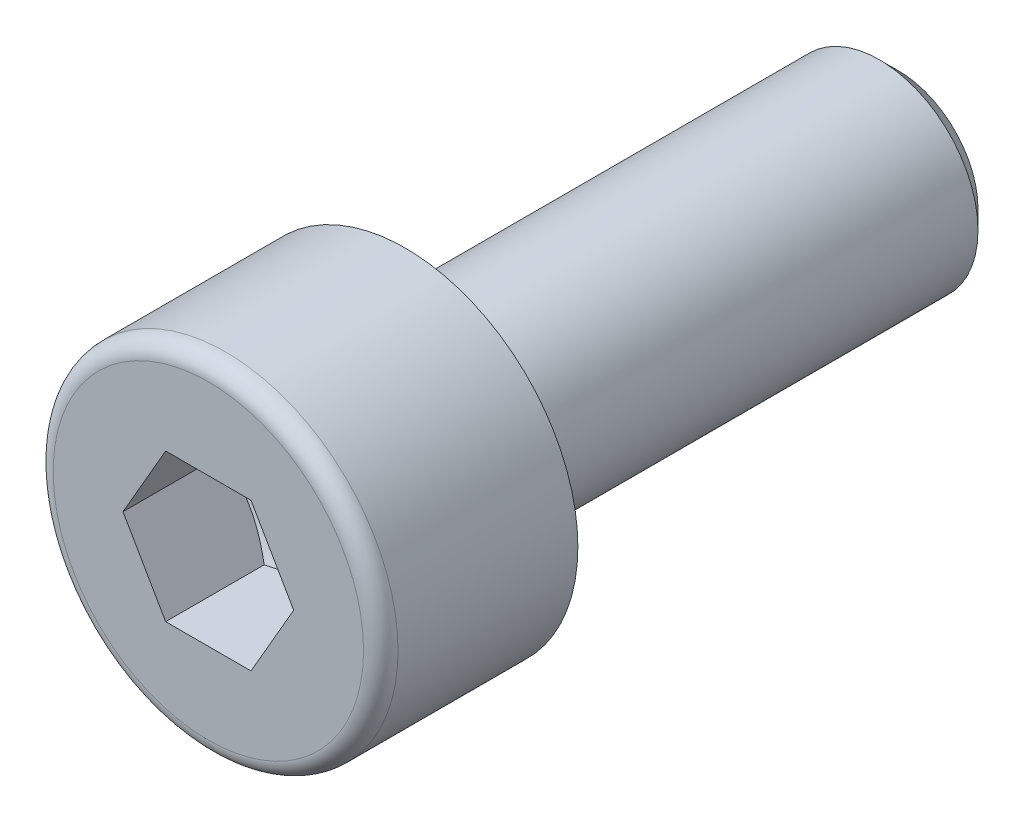
ISO-10303-21;
HEADER;
FILE_DESCRIPTION(('STEP AP214'),'2;1');
FILE_NAME('part.step','',(''),(''),'','','');
FILE_SCHEMA(('AUTOMOTIVE_DESIGN { 1 0 10303 214 1 1 1 1 }'));
ENDSEC;
DATA;
#1=APPLICATION_CONTEXT('core data for automotive mechanical design processes');
#2=APPLICATION_PROTOCOL_DEFINITION('international standard','automotive_design',2000,#1);
#3=PRODUCT_CONTEXT('',#1,'mechanical');
#4=PRODUCT('Part','Part','',(#3));
#5=PRODUCT_RELATED_PRODUCT_CATEGORY('part','',(#4));
#6=PRODUCT_DEFINITION_FORMATION('','',#4);
#7=PRODUCT_DEFINITION_CONTEXT('part definition',#1,'design');
#8=PRODUCT_DEFINITION('design','',#6,#7);
#9=PRODUCT_DEFINITION_SHAPE('','',#8);
#10=(LENGTH_UNIT() NAMED_UNIT(*) SI_UNIT(.MILLI.,.METRE.));
#11=(NAMED_UNIT(*) PLANE_ANGLE_UNIT() SI_UNIT($,.RADIAN.));
#12=(NAMED_UNIT(*) SI_UNIT($,.STERADIAN.) SOLID_ANGLE_UNIT());
#13=UNCERTAINTY_MEASURE_WITH_UNIT(LENGTH_MEASURE(1.E-05),#10,'distance_accuracy_value','');
#14=(GEOMETRIC_REPRESENTATION_CONTEXT(3) GLOBAL_UNCERTAINTY_ASSIGNED_CONTEXT((#13)) GLOBAL_UNIT_ASSIGNED_CONTEXT((#10,
#11,#12)) REPRESENTATION_CONTEXT('',''));
#15=CARTESIAN_POINT('',(0.,0.,0.));
#16=DIRECTION('',(0.,0.,1.));
#17=DIRECTION('',(1.,0.,0.));
#18=AXIS2_PLACEMENT_3D('',#15,#16,#17);
#19=CARTESIAN_POINT('',(0.,0.,4.));
#20=DIRECTION('',(0.,0.,1.));
#21=DIRECTION('',(1.,0.,0.));
#22=AXIS2_PLACEMENT_3D('',#19,#20,#21);
#23=PLANE('',#22);
#24=CARTESIAN_POINT('',(0.,0.,4.));
#25=DIRECTION('',(0.,0.,1.));
#26=DIRECTION('',(1.,0.,0.));
#27=AXIS2_PLACEMENT_3D('',#24,#25,#26);
#28=CIRCLE('',#27,3.15);
#29=CARTESIAN_POINT('',(3.15,0.,4.));
#30=VERTEX_POINT('',#29);
#31=EDGE_CURVE('E11',#30,#30,#28,.T.);
#32=ORIENTED_EDGE('',*,*,#31,.T.);
#33=EDGE_LOOP('',(#32));
#34=FACE_BOUND('',#33,.T.);
#35=DIRECTION('',(1.,0.,0.));
#36=VECTOR('',#35,1.);
#37=CARTESIAN_POINT('',(-0.866025,1.49999930062484,4.));
#38=LINE('',#37,#36);
#39=CARTESIAN_POINT('',(-0.866025,1.49999930062484,4.));
#40=VERTEX_POINT('',#39);
#41=CARTESIAN_POINT('',(0.866025,1.49999930062484,4.));
#42=VERTEX_POINT('',#41);
#43=EDGE_CURVE('E92',#40,#42,#38,.T.);
#44=ORIENTED_EDGE('',*,*,#43,.T.);
#45=DIRECTION('',(0.5,-0.866025403784439,0.));
#46=VECTOR('',#45,1.);
#47=CARTESIAN_POINT('',(0.866025,1.49999930062484,4.));
#48=LINE('',#47,#46);
#49=CARTESIAN_POINT('',(1.73205,0.,4.));
#50=VERTEX_POINT('',#49);
#51=EDGE_CURVE('E31',#42,#50,#48,.T.);
#52=ORIENTED_EDGE('',*,*,#51,.T.);
#53=DIRECTION('',(-0.5,-0.866025403784439,0.));
#54=VECTOR('',#53,1.);
#55=CARTESIAN_POINT('',(1.73205,0.,4.));
#56=LINE('',#55,#54);
#57=CARTESIAN_POINT('',(0.866025,-1.49999930062484,4.));
#58=VERTEX_POINT('',#57);
#59=EDGE_CURVE('E169',#50,#58,#56,.T.);
#60=ORIENTED_EDGE('',*,*,#59,.T.);
#61=DIRECTION('',(-1.,0.,0.));
#62=VECTOR('',#61,1.);
#63=CARTESIAN_POINT('',(0.866025,-1.49999930062484,4.));
#64=LINE('',#63,#62);
#65=CARTESIAN_POINT('',(-0.866025,-1.49999930062484,4.));
#66=VERTEX_POINT('',#65);
#67=EDGE_CURVE('E165',#58,#66,#64,.T.);
#68=ORIENTED_EDGE('',*,*,#67,.T.);
#69=DIRECTION('',(-0.5,0.866025403784439,0.));
#70=VECTOR('',#69,1.);
#71=CARTESIAN_POINT('',(-0.866025,-1.49999930062484,4.));
#72=LINE('',#71,#70);
#73=CARTESIAN_POINT('',(-1.73205,0.,4.));
#74=VERTEX_POINT('',#73);
#75=EDGE_CURVE('E160',#66,#74,#72,.T.);
#76=ORIENTED_EDGE('',*,*,#75,.T.);
#77=DIRECTION('',(0.5,0.866025403784439,0.));
#78=VECTOR('',#77,1.);
#79=CARTESIAN_POINT('',(-1.73205,0.,4.));
#80=LINE('',#79,#78);
#81=EDGE_CURVE('E96',#74,#40,#80,.T.);
#82=ORIENTED_EDGE('',*,*,#81,.T.);
#83=EDGE_LOOP('',(#44,#52,#60,#68,#76,#82));
#84=FACE_BOUND('',#83,.T.);
#85=ADVANCED_FACE('F17',(#34,#84),#23,.T.);
#86=CARTESIAN_POINT('',(0.,0.,3.65));
#87=DIRECTION('',(0.,0.,1.));
#88=DIRECTION('',(1.,0.,0.));
#89=AXIS2_PLACEMENT_3D('',#86,#87,#88);
#90=TOROIDAL_SURFACE('',#89,3.15,0.35);
#91=ORIENTED_EDGE('',*,*,#31,.F.);
#92=EDGE_LOOP('',(#91));
#93=FACE_BOUND('',#92,.T.);
#94=CARTESIAN_POINT('',(0.,0.,3.65));
#95=DIRECTION('',(0.,0.,1.));
#96=DIRECTION('',(1.,0.,0.));
#97=AXIS2_PLACEMENT_3D('',#94,#95,#96);
#98=CIRCLE('',#97,3.5);
#99=CARTESIAN_POINT('',(3.5,0.,3.65));
#100=VERTEX_POINT('',#99);
#101=EDGE_CURVE('E24',#100,#100,#98,.T.);
#102=ORIENTED_EDGE('',*,*,#101,.T.);
#103=EDGE_LOOP('',(#102));
#104=FACE_BOUND('',#103,.T.);
#105=ADVANCED_FACE('F133',(#93,#104),#90,.T.);
#106=CARTESIAN_POINT('',(0.,0.,4.));
#107=DIRECTION('',(0.,0.,1.));
#108=DIRECTION('',(1.,0.,0.));
#109=AXIS2_PLACEMENT_3D('',#106,#107,#108);
#110=CYLINDRICAL_SURFACE('',#109,3.5);
#111=CARTESIAN_POINT('',(0.,0.,0.));
#112=DIRECTION('',(0.,0.,1.));
#113=DIRECTION('',(1.,0.,0.));
#114=AXIS2_PLACEMENT_3D('',#111,#112,#113);
#115=CIRCLE('',#114,3.5);
#116=CARTESIAN_POINT('',(3.5,0.,0.));
#117=VERTEX_POINT('',#116);
#118=EDGE_CURVE('E128',#117,#117,#115,.T.);
#119=ORIENTED_EDGE('',*,*,#118,.T.);
#120=EDGE_LOOP('',(#119));
#121=FACE_BOUND('',#120,.T.);
#122=ORIENTED_EDGE('',*,*,#101,.F.);
#123=EDGE_LOOP('',(#122));
#124=FACE_BOUND('',#123,.T.);
#125=ADVANCED_FACE('F135',(#121,#124),#110,.T.);
#126=CARTESIAN_POINT('',(0.,3.5,0.));
#127=DIRECTION('',(0.,0.,-1.));
#128=DIRECTION('',(-1.,0.,0.));
#129=AXIS2_PLACEMENT_3D('',#126,#127,#128);
#130=PLANE('',#129);
#131=CARTESIAN_POINT('',(0.,0.,0.));
#132=DIRECTION('',(0.,0.,1.));
#133=DIRECTION('',(1.,0.,0.));
#134=AXIS2_PLACEMENT_3D('',#131,#132,#133);
#135=CIRCLE('',#134,2.2);
#136=CARTESIAN_POINT('',(2.2,0.,0.));
#137=VERTEX_POINT('',#136);
#138=EDGE_CURVE('E125',#137,#137,#135,.T.);
#139=ORIENTED_EDGE('',*,*,#138,.T.);
#140=EDGE_LOOP('',(#139));
#141=FACE_BOUND('',#140,.T.);
#142=ORIENTED_EDGE('',*,*,#118,.F.);
#143=EDGE_LOOP('',(#142));
#144=FACE_BOUND('',#143,.T.);
#145=ADVANCED_FACE('F137',(#141,#144),#130,.T.);
#146=CARTESIAN_POINT('',(0.,0.,-0.2));
#147=DIRECTION('',(0.,0.,1.));
#148=DIRECTION('',(1.,0.,0.));
#149=AXIS2_PLACEMENT_3D('',#146,#147,#148);
#150=TOROIDAL_SURFACE('',#149,2.2,0.2);
#151=CARTESIAN_POINT('',(0.,0.,-0.2));
#152=DIRECTION('',(0.,0.,1.));
#153=DIRECTION('',(1.,0.,0.));
#154=AXIS2_PLACEMENT_3D('',#151,#152,#153);
#155=CIRCLE('',#154,2.);
#156=CARTESIAN_POINT('',(2.,0.,-0.2));
#157=VERTEX_POINT('',#156);
#158=EDGE_CURVE('E122',#157,#157,#155,.T.);
#159=ORIENTED_EDGE('',*,*,#158,.T.);
#160=EDGE_LOOP('',(#159));
#161=FACE_BOUND('',#160,.T.);
#162=ORIENTED_EDGE('',*,*,#138,.F.);
#163=EDGE_LOOP('',(#162));
#164=FACE_BOUND('',#163,.T.);
#165=ADVANCED_FACE('F145',(#161,#164),#150,.F.);
#166=CARTESIAN_POINT('',(0.,0.,4.));
#167=DIRECTION('',(0.,0.,1.));
#168=DIRECTION('',(1.,0.,0.));
#169=AXIS2_PLACEMENT_3D('',#166,#167,#168);
#170=CYLINDRICAL_SURFACE('',#169,2.);
#171=CARTESIAN_POINT('',(0.,0.,-0.201));
#172=DIRECTION('',(0.,0.,1.));
#173=DIRECTION('',(1.,0.,0.));
#174=AXIS2_PLACEMENT_3D('',#171,#172,#173);
#175=CIRCLE('',#174,2.);
#176=CARTESIAN_POINT('',(2.,0.,-0.201));
#177=VERTEX_POINT('',#176);
#178=EDGE_CURVE('E119',#177,#177,#175,.T.);
#179=ORIENTED_EDGE('',*,*,#178,.T.);
#180=EDGE_LOOP('',(#179));
#181=FACE_BOUND('',#180,.T.);
#182=ORIENTED_EDGE('',*,*,#158,.F.);
#183=EDGE_LOOP('',(#182));
#184=FACE_BOUND('',#183,.T.);
#185=ADVANCED_FACE('F346',(#181,#184),#170,.T.);
#186=CARTESIAN_POINT('',(0.,0.,-0.201));
#187=DIRECTION('',(0.,0.,1.));
#188=DIRECTION('',(1.,0.,0.));
#189=AXIS2_PLACEMENT_3D('',#186,#187,#188);
#190=CONICAL_SURFACE('',#189,2.,0.523598775598299);
#191=CARTESIAN_POINT('',(0.,0.,-0.857230749717659));
#192=DIRECTION('',(0.,0.,1.));
#193=DIRECTION('',(1.,0.,0.));
#194=AXIS2_PLACEMENT_3D('',#191,#192,#193);
#195=CIRCLE('',#194,1.621125);
#196=CARTESIAN_POINT('',(1.621125,0.,-0.857230749717659));
#197=VERTEX_POINT('',#196);
#198=EDGE_CURVE('E116',#197,#197,#195,.T.);
#199=ORIENTED_EDGE('',*,*,#198,.T.);
#200=EDGE_LOOP('',(#199));
#201=FACE_BOUND('',#200,.T.);
#202=ORIENTED_EDGE('',*,*,#178,.F.);
#203=EDGE_LOOP('',(#202));
#204=FACE_BOUND('',#203,.T.);
#205=ADVANCED_FACE('F337',(#201,#204),#190,.T.);
#206=CARTESIAN_POINT('',(0.,1.621125,-0.857230749717659));
#207=DIRECTION('',(0.,0.,1.));
#208=DIRECTION('',(1.,0.,0.));
#209=AXIS2_PLACEMENT_3D('',#206,#207,#208);
#210=PLANE('',#209);
#211=CARTESIAN_POINT('',(0.,0.,-0.857230749717659));
#212=DIRECTION('',(0.,0.,1.));
#213=DIRECTION('',(1.,0.,0.));
#214=AXIS2_PLACEMENT_3D('',#211,#212,#213);
#215=CIRCLE('',#214,2.);
#216=CARTESIAN_POINT('',(2.,0.,-0.857230749717659));
#217=VERTEX_POINT('',#216);
#218=EDGE_CURVE('E113',#217,#217,#215,.T.);
#219=ORIENTED_EDGE('',*,*,#218,.T.);
#220=EDGE_LOOP('',(#219));
#221=FACE_BOUND('',#220,.T.);
#222=ORIENTED_EDGE('',*,*,#198,.F.);
#223=EDGE_LOOP('',(#222));
#224=FACE_BOUND('',#223,.T.);
#225=ADVANCED_FACE('F322',(#221,#224),#210,.T.);
#226=CARTESIAN_POINT('',(0.,0.,4.));
#227=DIRECTION('',(0.,0.,1.));
#228=DIRECTION('',(1.,0.,0.));
#229=AXIS2_PLACEMENT_3D('',#226,#227,#228);
#230=CYLINDRICAL_SURFACE('',#229,2.);
#231=CARTESIAN_POINT('',(0.,0.,-9.621125));
#232=DIRECTION('',(0.,0.,1.));
#233=DIRECTION('',(1.,0.,0.));
#234=AXIS2_PLACEMENT_3D('',#231,#232,#233);
#235=CIRCLE('',#234,2.);
#236=CARTESIAN_POINT('',(2.,0.,-9.621125));
#237=VERTEX_POINT('',#236);
#238=EDGE_CURVE('E110',#237,#237,#235,.T.);
#239=ORIENTED_EDGE('',*,*,#238,.T.);
#240=EDGE_LOOP('',(#239));
#241=FACE_BOUND('',#240,.T.);
#242=ORIENTED_EDGE('',*,*,#218,.F.);
#243=EDGE_LOOP('',(#242));
#244=FACE_BOUND('',#243,.T.);
#245=ADVANCED_FACE('F311',(#241,#244),#230,.T.);
#246=CARTESIAN_POINT('',(0.,0.,-9.621125));
#247=DIRECTION('',(0.,0.,1.));
#248=DIRECTION('',(1.,0.,0.));
#249=AXIS2_PLACEMENT_3D('',#246,#247,#248);
#250=CONICAL_SURFACE('',#249,2.,0.785398163397448);
#251=CARTESIAN_POINT('',(0.,0.,-10.));
#252=DIRECTION('',(0.,0.,1.));
#253=DIRECTION('',(1.,0.,0.));
#254=AXIS2_PLACEMENT_3D('',#251,#252,#253);
#255=CIRCLE('',#254,1.621125);
#256=CARTESIAN_POINT('',(1.621125,0.,-10.));
#257=VERTEX_POINT('',#256);
#258=EDGE_CURVE('E107',#257,#257,#255,.T.);
#259=ORIENTED_EDGE('',*,*,#258,.T.);
#260=EDGE_LOOP('',(#259));
#261=FACE_BOUND('',#260,.T.);
#262=ORIENTED_EDGE('',*,*,#238,.F.);
#263=EDGE_LOOP('',(#262));
#264=FACE_BOUND('',#263,.T.);
#265=ADVANCED_FACE('F303',(#261,#264),#250,.T.);
#266=CARTESIAN_POINT('',(0.,1.621125,-10.));
#267=DIRECTION('',(0.,0.,-1.));
#268=DIRECTION('',(-1.,0.,0.));
#269=AXIS2_PLACEMENT_3D('',#266,#267,#268);
#270=PLANE('',#269);
#271=ORIENTED_EDGE('',*,*,#258,.F.);
#272=EDGE_LOOP('',(#271));
#273=FACE_BOUND('',#272,.T.);
#274=ADVANCED_FACE('F225',(#273),#270,.T.);
#275=CARTESIAN_POINT('',(0.866025,1.49999930062484,1.00000046625011));
#276=DIRECTION('',(-0.866025403784439,-0.5,0.));
#277=DIRECTION('',(-0.5,0.866025403784439,0.));
#278=AXIS2_PLACEMENT_3D('',#275,#276,#277);
#279=PLANE('',#278);
#280=DIRECTION('',(0.,0.,1.));
#281=VECTOR('',#280,1.);
#282=CARTESIAN_POINT('',(1.73205,0.,1.00000046625011));
#283=LINE('',#282,#281);
#284=CARTESIAN_POINT('',(1.73205,0.,2.));
#285=VERTEX_POINT('',#284);
#286=EDGE_CURVE('E105',#285,#50,#283,.T.);
#287=ORIENTED_EDGE('',*,*,#286,.T.);
#288=ORIENTED_EDGE('',*,*,#51,.F.);
#289=DIRECTION('',(0.,0.,1.));
#290=VECTOR('',#289,1.);
#291=CARTESIAN_POINT('',(0.866025,1.49999930062484,1.00000046625011));
#292=LINE('',#291,#290);
#293=CARTESIAN_POINT('',(0.866025,1.49999930062484,2.));
#294=VERTEX_POINT('',#293);
#295=EDGE_CURVE('E86',#294,#42,#292,.T.);
#296=ORIENTED_EDGE('',*,*,#295,.F.);
#297=CARTESIAN_POINT('',(1.73205011547005,-2.E-07,2.00000006666668));
#298=CARTESIAN_POINT('',(1.69399355960807,0.0659156883140366,1.97802173028335));
#299=CARTESIAN_POINT('',(1.65560850010158,0.132400561630831,1.95803358276683));
#300=CARTESIAN_POINT('',(1.57817376930088,0.266521449648072,1.92314486968736));
#301=CARTESIAN_POINT('',(1.53912272258805,0.334159846643437,1.90825664508476));
#302=CARTESIAN_POINT('',(1.46150456926693,0.468598431785277,1.88508204749495));
#303=CARTESIAN_POINT('',(1.42294940186896,0.535377940612901,1.87664141677747));
#304=CARTESIAN_POINT('',(1.3456577466905,0.669251014383079,1.86656694500549));
#305=CARTESIAN_POINT('',(1.30692153965187,0.736344093066485,1.86492475942064));
#306=CARTESIAN_POINT('',(1.23454707710054,0.861700339375888,1.86834977089927));
#307=CARTESIAN_POINT('',(1.20089796127324,0.919982317618542,1.87257601411643));
#308=CARTESIAN_POINT('',(1.13381894265803,1.03616658598195,1.88596802250537));
#309=CARTESIAN_POINT('',(1.10038927170579,1.09406847455153,1.8951383578945));
#310=CARTESIAN_POINT('',(1.03317206370895,1.21049209394498,1.91806242401527));
#311=CARTESIAN_POINT('',(0.99939302962827,1.26899909720332,1.93191328313792));
#312=CARTESIAN_POINT('',(0.932338630377582,1.38514072357652,1.96334887867764));
#313=CARTESIAN_POINT('',(0.899062406824236,1.44277683345494,1.98092623371015));
#314=CARTESIAN_POINT('',(0.866024884529945,1.49999950062484,2.00000006666668));
#315=B_SPLINE_CURVE_WITH_KNOTS('',3,(#297,#298,#299,#300,#301,#302,#303,#304,#305,#306,#307,
#308,#309,#310,#311,#312,#313,#314),.UNSPECIFIED.,.F.,.F.,(4,2,2,2,2,2,2,2,4),(0.,
0.237761913623107,0.476095172847884,0.70853042062033,0.940680288567599,1.14278046683928,
1.34506778348019,1.5518408666055,1.75820814090333),.UNSPECIFIED.);
#316=EDGE_CURVE('E79',#285,#294,#315,.T.);
#317=ORIENTED_EDGE('',*,*,#316,.F.);
#318=EDGE_LOOP('',(#287,#288,#296,#317));
#319=FACE_BOUND('',#318,.T.);
#320=ADVANCED_FACE('F87',(#319),#279,.T.);
#321=CARTESIAN_POINT('',(1.73205,0.,1.00000046625011));
#322=DIRECTION('',(-0.866025403784439,0.5,0.));
#323=DIRECTION('',(0.5,0.866025403784439,0.));
#324=AXIS2_PLACEMENT_3D('',#321,#322,#323);
#325=PLANE('',#324);
#326=DIRECTION('',(0.,0.,1.));
#327=VECTOR('',#326,1.);
#328=CARTESIAN_POINT('',(0.866025,-1.49999930062484,1.00000046625011));
#329=LINE('',#328,#327);
#330=CARTESIAN_POINT('',(0.866025,-1.49999930062484,2.));
#331=VERTEX_POINT('',#330);
#332=EDGE_CURVE('E103',#331,#58,#329,.T.);
#333=ORIENTED_EDGE('',*,*,#332,.T.);
#334=ORIENTED_EDGE('',*,*,#59,.F.);
#335=ORIENTED_EDGE('',*,*,#286,.F.);
#336=CARTESIAN_POINT('',(0.866024884529947,-1.49999950062484,2.00000006666668));
#337=CARTESIAN_POINT('',(0.904081440391929,-1.4340836123108,1.97802173028335));
#338=CARTESIAN_POINT('',(0.942466499898418,-1.36759873899401,1.95803358276683));
#339=CARTESIAN_POINT('',(1.01990123069912,-1.23347785097676,1.92314486968736));
#340=CARTESIAN_POINT('',(1.05895227741195,-1.1658394539814,1.90825664508476));
#341=CARTESIAN_POINT('',(1.13657043073307,-1.03140086883956,1.88508204749495));
#342=CARTESIAN_POINT('',(1.17512559813105,-0.964621360011936,1.87664141677746));
#343=CARTESIAN_POINT('',(1.2524172533095,-0.830748286241757,1.86656694500549));
#344=CARTESIAN_POINT('',(1.29115346034813,-0.763655207558351,1.86492475942064));
#345=CARTESIAN_POINT('',(1.36352792289946,-0.638298961248948,1.86834977089927));
#346=CARTESIAN_POINT('',(1.39717703872676,-0.580016983006295,1.87257601411643));
#347=CARTESIAN_POINT('',(1.46425605734197,-0.46383271464289,1.88596802250537));
#348=CARTESIAN_POINT('',(1.49768572829421,-0.405930826073305,1.8951383578945));
#349=CARTESIAN_POINT('',(1.56490293629105,-0.289507206679854,1.91806242401527));
#350=CARTESIAN_POINT('',(1.59868197037173,-0.231000203421515,1.93191328313792));
#351=CARTESIAN_POINT('',(1.66573636962242,-0.114858577048316,1.96334887867764));
#352=CARTESIAN_POINT('',(1.69901259317576,-0.0572224671699004,1.98092623371015));
#353=CARTESIAN_POINT('',(1.73205011547005,1.99999999863076E-07,2.00000006666668));
#354=B_SPLINE_CURVE_WITH_KNOTS('',3,(#336,#337,#338,#339,#340,#341,#342,#343,#344,#345,#346,
#347,#348,#349,#350,#351,#352,#353),.UNSPECIFIED.,.F.,.F.,(4,2,2,2,2,2,2,2,4),(0.,
0.237761913623106,0.476095172847883,0.708530420620329,0.940680288567598,1.14278046683928,
1.34506778348018,1.5518408666055,1.75820814090332),.UNSPECIFIED.);
#355=EDGE_CURVE('E83',#331,#285,#354,.T.);
#356=ORIENTED_EDGE('',*,*,#355,.F.);
#357=EDGE_LOOP('',(#333,#334,#335,#356));
#358=FACE_BOUND('',#357,.T.);
#359=ADVANCED_FACE('F216',(#358),#325,.T.);
#360=CARTESIAN_POINT('',(0.866025,-1.49999930062484,1.00000046625011));
#361=DIRECTION('',(0.,1.,0.));
#362=DIRECTION('',(1.,0.,0.));
#363=AXIS2_PLACEMENT_3D('',#360,#361,#362);
#364=PLANE('',#363);
#365=DIRECTION('',(0.,0.,1.));
#366=VECTOR('',#365,1.);
#367=CARTESIAN_POINT('',(-0.866025,-1.49999930062484,1.00000046625011));
#368=LINE('',#367,#366);
#369=CARTESIAN_POINT('',(-0.866025,-1.49999930062484,2.));
#370=VERTEX_POINT('',#369);
#371=EDGE_CURVE('E101',#370,#66,#368,.T.);
#372=ORIENTED_EDGE('',*,*,#371,.T.);
#373=ORIENTED_EDGE('',*,*,#67,.F.);
#374=ORIENTED_EDGE('',*,*,#332,.F.);
#375=CARTESIAN_POINT('',(-2.24271663728987,-1.49999930062484,2.55775267344395));
#376=CARTESIAN_POINT('',(-2.17737885850653,-1.49999930062484,2.52640634014157));
#377=CARTESIAN_POINT('',(-2.11188074232534,-1.49999930062484,2.49538818329887));
#378=CARTESIAN_POINT('',(-1.98047676400116,-1.49999930062484,2.43419642592191));
#379=CARTESIAN_POINT('',(-1.9145708279013,-1.49999930062484,2.40402298440166));
#380=CARTESIAN_POINT('',(-1.78188435758135,-1.49999930062484,2.34453954384712));
#381=CARTESIAN_POINT('',(-1.71510093993348,-1.49999930062484,2.31523594760146));
#382=CARTESIAN_POINT('',(-1.58096751155698,-1.49999930062484,2.25796395662842));
#383=CARTESIAN_POINT('',(-1.51361753246252,-1.49999930062484,2.22999548792811));
#384=CARTESIAN_POINT('',(-1.37764691173254,-1.49999930062484,2.17551311607621));
#385=CARTESIAN_POINT('',(-1.30902031899905,-1.49999930062484,2.14901387224848));
#386=CARTESIAN_POINT('',(-1.17095590110837,-1.49999930062484,2.0982278618441));
#387=CARTESIAN_POINT('',(-1.10151797806402,-1.49999930062484,2.07394136541163));
#388=CARTESIAN_POINT('',(-0.892105328886785,-1.49999930062484,2.00541752509133));
#389=CARTESIAN_POINT('',(-0.750648656091658,-1.49999930062484,1.96535523961827));
#390=CARTESIAN_POINT('',(-0.535282360404881,-1.49999930062484,1.91871523756084));
#391=CARTESIAN_POINT('',(-0.462838502986777,-1.49999930062484,1.90539977312406));
#392=CARTESIAN_POINT('',(-0.317131889203395,-1.49999930062484,1.88423291093832));
#393=CARTESIAN_POINT('',(-0.243869121170523,-1.49999930062484,1.87638159114194));
#394=CARTESIAN_POINT('',(-0.0973355173554993,-1.49999930062484,1.86683590353645));
#395=CARTESIAN_POINT('',(-0.0240669224075873,-1.49999930062484,1.86510805752267));
#396=CARTESIAN_POINT('',(0.122329353623029,-1.49999930062484,1.86787172817698));
#397=CARTESIAN_POINT('',(0.195457062232611,-1.49999930062484,1.87236187254558));
#398=CARTESIAN_POINT('',(0.37563410330327,-1.49999930062484,1.89068564362563));
#399=CARTESIAN_POINT('',(0.48233638783704,-1.49999930062484,1.90793865775151));
#400=CARTESIAN_POINT('',(0.693781730996338,-1.49999930062484,1.95246053078219));
#401=CARTESIAN_POINT('',(0.798519460630952,-1.49999930062484,1.97975337753549));
#402=CARTESIAN_POINT('',(1.00810283272939,-1.49999930062484,2.04211728711063));
#403=CARTESIAN_POINT('',(1.11290050959386,-1.49999930062484,2.07734574338509));
#404=CARTESIAN_POINT('',(1.26837829623688,-1.49999930062484,2.13390013338983));
#405=CARTESIAN_POINT('',(1.31977465105504,-1.49999930062484,2.15331006037323));
#406=CARTESIAN_POINT('',(1.42213832879305,-1.49999930062484,2.19318317564688));
#407=CARTESIAN_POINT('',(1.47310578815343,-1.49999930062484,2.21364601301376));
#408=CARTESIAN_POINT('',(1.52389647169172,-1.49999930062484,2.23453929489686));
#409=B_SPLINE_CURVE_WITH_KNOTS('',3,(#375,#376,#377,#378,#379,#380,#381,#382,#383,#384,#385,
#386,#387,#388,#389,#390,#391,#392,#393,#394,#395,#396,#397,#398,#399,#400,#401,#402,#403,#404,
#405,#406,#407,#408),.UNSPECIFIED.,.F.,.F.,(4,2,2,2,2,2,2,2,2,2,2,2,2,2,2,2,4),(0.,
0.217407046476814,0.434854747383871,0.653631180292388,0.872395477761214,1.09305035510591,
1.31373213519492,1.75385156231779,1.97465732248945,2.19546623265606,2.41506605979781,
2.63461742936842,2.95821044680194,3.28258169025048,3.61406358496068,3.77887383962508,
3.94362951623072),.UNSPECIFIED.);
#410=EDGE_CURVE('E207',#370,#331,#409,.T.);
#411=ORIENTED_EDGE('',*,*,#410,.F.);
#412=EDGE_LOOP('',(#372,#373,#374,#411));
#413=FACE_BOUND('',#412,.T.);
#414=ADVANCED_FACE('F212',(#413),#364,.T.);
#415=CARTESIAN_POINT('',(-0.866025,-1.49999930062484,1.00000046625011));
#416=DIRECTION('',(0.866025403784439,0.5,0.));
#417=DIRECTION('',(0.5,-0.866025403784439,0.));
#418=AXIS2_PLACEMENT_3D('',#415,#416,#417);
#419=PLANE('',#418);
#420=DIRECTION('',(0.,0.,1.));
#421=VECTOR('',#420,1.);
#422=CARTESIAN_POINT('',(-1.73205,0.,1.00000046625011));
#423=LINE('',#422,#421);
#424=CARTESIAN_POINT('',(-1.73205,0.,2.));
#425=VERTEX_POINT('',#424);
#426=EDGE_CURVE('E94',#425,#74,#423,.T.);
#427=ORIENTED_EDGE('',*,*,#426,.T.);
#428=ORIENTED_EDGE('',*,*,#75,.F.);
#429=ORIENTED_EDGE('',*,*,#371,.F.);
#430=CARTESIAN_POINT('',(-1.73205011547005,1.99999999777955E-07,2.00000006666668));
#431=CARTESIAN_POINT('',(-1.69399355960807,-0.065915688314037,1.97802173028335));
#432=CARTESIAN_POINT('',(-1.65560850010158,-0.132400561630831,1.95803358276683));
#433=CARTESIAN_POINT('',(-1.57817376930088,-0.266521449648073,1.92314486968736));
#434=CARTESIAN_POINT('',(-1.53912272258805,-0.334159846643437,1.90825664508476));
#435=CARTESIAN_POINT('',(-1.46150456926693,-0.468598431785278,1.88508204749495));
#436=CARTESIAN_POINT('',(-1.42294940186895,-0.535377940612901,1.87664141677747));
#437=CARTESIAN_POINT('',(-1.3456577466905,-0.66925101438308,1.86656694500549));
#438=CARTESIAN_POINT('',(-1.30692153965187,-0.736344093066486,1.86492475942064));
#439=CARTESIAN_POINT('',(-1.23454707710054,-0.861700339375889,1.86834977089927));
#440=CARTESIAN_POINT('',(-1.20089796127324,-0.919982317618542,1.87257601411643));
#441=CARTESIAN_POINT('',(-1.13381894265803,-1.03616658598195,1.88596802250537));
#442=CARTESIAN_POINT('',(-1.10038927170579,-1.09406847455153,1.8951383578945));
#443=CARTESIAN_POINT('',(-1.03317206370895,-1.21049209394498,1.91806242401527));
#444=CARTESIAN_POINT('',(-0.999393029628271,-1.26899909720332,1.93191328313792));
#445=CARTESIAN_POINT('',(-0.932338630377583,-1.38514072357652,1.96334887867764));
#446=CARTESIAN_POINT('',(-0.899062406824237,-1.44277683345494,1.98092623371015));
#447=CARTESIAN_POINT('',(-0.866024884529946,-1.49999950062484,2.00000006666668));
#448=B_SPLINE_CURVE_WITH_KNOTS('',3,(#430,#431,#432,#433,#434,#435,#436,#437,#438,#439,#440,
#441,#442,#443,#444,#445,#446,#447),.UNSPECIFIED.,.F.,.F.,(4,2,2,2,2,2,2,2,4),(0.,
0.237761913623106,0.476095172847884,0.708530420620331,0.940680288567599,1.14278046683928,
1.34506778348018,1.5518408666055,1.75820814090332),.UNSPECIFIED.);
#449=EDGE_CURVE('E202',#425,#370,#448,.T.);
#450=ORIENTED_EDGE('',*,*,#449,.F.);
#451=EDGE_LOOP('',(#427,#428,#429,#450));
#452=FACE_BOUND('',#451,.T.);
#453=ADVANCED_FACE('F215',(#452),#419,.T.);
#454=CARTESIAN_POINT('',(-1.73205,0.,1.00000046625011));
#455=DIRECTION('',(0.866025403784439,-0.5,0.));
#456=DIRECTION('',(-0.5,-0.866025403784439,0.));
#457=AXIS2_PLACEMENT_3D('',#454,#455,#456);
#458=PLANE('',#457);
#459=DIRECTION('',(0.,0.,1.));
#460=VECTOR('',#459,1.);
#461=CARTESIAN_POINT('',(-0.866025,1.49999930062484,1.00000046625011));
#462=LINE('',#461,#460);
#463=CARTESIAN_POINT('',(-0.866025,1.49999930062484,2.));
#464=VERTEX_POINT('',#463);
#465=EDGE_CURVE('E91',#464,#40,#462,.T.);
#466=ORIENTED_EDGE('',*,*,#465,.T.);
#467=ORIENTED_EDGE('',*,*,#81,.F.);
#468=ORIENTED_EDGE('',*,*,#426,.F.);
#469=CARTESIAN_POINT('',(-0.866024884529947,1.49999950062484,2.00000006666668));
#470=CARTESIAN_POINT('',(-0.904081440391929,1.4340836123108,1.97802173028335));
#471=CARTESIAN_POINT('',(-0.942466499898419,1.367598738994,1.95803358276683));
#472=CARTESIAN_POINT('',(-1.01990123069912,1.23347785097676,1.92314486968736));
#473=CARTESIAN_POINT('',(-1.05895227741195,1.1658394539814,1.90825664508476));
#474=CARTESIAN_POINT('',(-1.13657043073307,1.03140086883956,1.88508204749495));
#475=CARTESIAN_POINT('',(-1.17512559813105,0.964621360011936,1.87664141677746));
#476=CARTESIAN_POINT('',(-1.2524172533095,0.830748286241757,1.86656694500549));
#477=CARTESIAN_POINT('',(-1.29115346034813,0.763655207558351,1.86492475942064));
#478=CARTESIAN_POINT('',(-1.36352792289946,0.638298961248948,1.86834977089927));
#479=CARTESIAN_POINT('',(-1.39717703872676,0.580016983006295,1.87257601411643));
#480=CARTESIAN_POINT('',(-1.46425605734197,0.46383271464289,1.88596802250537));
#481=CARTESIAN_POINT('',(-1.49768572829421,0.405930826073305,1.8951383578945));
#482=CARTESIAN_POINT('',(-1.56490293629105,0.289507206679853,1.91806242401527));
#483=CARTESIAN_POINT('',(-1.59868197037173,0.231000203421515,1.93191328313792));
#484=CARTESIAN_POINT('',(-1.66573636962242,0.114858577048315,1.96334887867764));
#485=CARTESIAN_POINT('',(-1.69901259317576,0.0572224671699002,1.98092623371015));
#486=CARTESIAN_POINT('',(-1.73205011547005,-2.00000000034373E-07,2.00000006666668));
#487=B_SPLINE_CURVE_WITH_KNOTS('',3,(#469,#470,#471,#472,#473,#474,#475,#476,#477,#478,#479,
#480,#481,#482,#483,#484,#485,#486),.UNSPECIFIED.,.F.,.F.,(4,2,2,2,2,2,2,2,4),(0.,
0.237761913623106,0.476095172847883,0.708530420620329,0.940680288567598,1.14278046683928,
1.34506778348018,1.5518408666055,1.75820814090332),.UNSPECIFIED.);
#488=EDGE_CURVE('E39',#464,#425,#487,.T.);
#489=ORIENTED_EDGE('',*,*,#488,.F.);
#490=EDGE_LOOP('',(#466,#467,#468,#489));
#491=FACE_BOUND('',#490,.T.);
#492=ADVANCED_FACE('F159',(#491),#458,.T.);
#493=CARTESIAN_POINT('',(-0.866025,1.49999930062484,1.00000046625011));
#494=DIRECTION('',(0.,-1.,0.));
#495=DIRECTION('',(-1.,0.,0.));
#496=AXIS2_PLACEMENT_3D('',#493,#494,#495);
#497=PLANE('',#496);
#498=ORIENTED_EDGE('',*,*,#295,.T.);
#499=ORIENTED_EDGE('',*,*,#43,.F.);
#500=ORIENTED_EDGE('',*,*,#465,.F.);
#501=CARTESIAN_POINT('',(-2.24271663728987,1.49999930062484,2.55775267344395));
#502=CARTESIAN_POINT('',(-2.17737885850653,1.49999930062484,2.52640634014157));
#503=CARTESIAN_POINT('',(-2.11188074232534,1.49999930062484,2.49538818329887));
#504=CARTESIAN_POINT('',(-1.98047676400116,1.49999930062484,2.43419642592191));
#505=CARTESIAN_POINT('',(-1.91457082790131,1.49999930062484,2.40402298440166));
#506=CARTESIAN_POINT('',(-1.78188435758136,1.49999930062484,2.34453954384712));
#507=CARTESIAN_POINT('',(-1.71510093993348,1.49999930062484,2.31523594760146));
#508=CARTESIAN_POINT('',(-1.58096751155698,1.49999930062484,2.25796395662842));
#509=CARTESIAN_POINT('',(-1.51361753246252,1.49999930062484,2.22999548792811));
#510=CARTESIAN_POINT('',(-1.37764691173254,1.49999930062484,2.17551311607621));
#511=CARTESIAN_POINT('',(-1.30902031899905,1.49999930062484,2.14901387224848));
#512=CARTESIAN_POINT('',(-1.17095590110837,1.49999930062484,2.0982278618441));
#513=CARTESIAN_POINT('',(-1.10151797806402,1.49999930062484,2.07394136541163));
#514=CARTESIAN_POINT('',(-0.892105328886786,1.49999930062484,2.00541752509133));
#515=CARTESIAN_POINT('',(-0.750648656091659,1.49999930062484,1.96535523961827));
#516=CARTESIAN_POINT('',(-0.535282360404882,1.49999930062484,1.91871523756084));
#517=CARTESIAN_POINT('',(-0.462838502986778,1.49999930062484,1.90539977312406));
#518=CARTESIAN_POINT('',(-0.317131889203395,1.49999930062484,1.88423291093832));
#519=CARTESIAN_POINT('',(-0.243869121170524,1.49999930062484,1.87638159114194));
#520=CARTESIAN_POINT('',(-0.0973355173555001,1.49999930062484,1.86683590353645));
#521=CARTESIAN_POINT('',(-0.0240669224075883,1.49999930062484,1.86510805752267));
#522=CARTESIAN_POINT('',(0.122329353623028,1.49999930062484,1.86787172817698));
#523=CARTESIAN_POINT('',(0.19545706223261,1.49999930062484,1.87236187254558));
#524=CARTESIAN_POINT('',(0.375634103303269,1.49999930062484,1.89068564362563));
#525=CARTESIAN_POINT('',(0.482336387837038,1.49999930062484,1.90793865775151));
#526=CARTESIAN_POINT('',(0.693781730996335,1.49999930062484,1.95246053078219));
#527=CARTESIAN_POINT('',(0.798519460630948,1.49999930062484,1.97975337753549));
#528=CARTESIAN_POINT('',(1.00810283272939,1.49999930062484,2.04211728711063));
#529=CARTESIAN_POINT('',(1.11290050959386,1.49999930062484,2.07734574338509));
#530=CARTESIAN_POINT('',(1.26837829623688,1.49999930062484,2.13390013338983));
#531=CARTESIAN_POINT('',(1.31977465105503,1.49999930062484,2.15331006037323));
#532=CARTESIAN_POINT('',(1.42213832879305,1.49999930062484,2.19318317564688));
#533=CARTESIAN_POINT('',(1.47310578815342,1.49999930062484,2.21364601301376));
#534=CARTESIAN_POINT('',(1.52389647169172,1.49999930062484,2.23453929489686));
#535=B_SPLINE_CURVE_WITH_KNOTS('',3,(#501,#502,#503,#504,#505,#506,#507,#508,#509,#510,#511,
#512,#513,#514,#515,#516,#517,#518,#519,#520,#521,#522,#523,#524,#525,#526,#527,#528,#529,#530,
#531,#532,#533,#534),.UNSPECIFIED.,.F.,.F.,(4,2,2,2,2,2,2,2,2,2,2,2,2,2,2,2,4),(0.,
0.217407046476813,0.434854747383869,0.653631180292387,0.872395477761212,1.09305035510591,
1.31373213519491,1.75385156231779,1.97465732248945,2.19546623265605,2.41506605979781,
2.63461742936842,2.95821044680194,3.28258169025047,3.61406358496067,3.77887383962508,
3.94362951623071),.UNSPECIFIED.);
#536=EDGE_CURVE('E80',#294,#464,#535,.F.);
#537=ORIENTED_EDGE('',*,*,#536,.F.);
#538=EDGE_LOOP('',(#498,#499,#500,#537));
#539=FACE_BOUND('',#538,.T.);
#540=ADVANCED_FACE('F75',(#539),#497,.T.);
#541=CARTESIAN_POINT('',(0.,0.,1.00000046625011));
#542=DIRECTION('',(0.,0.,1.));
#543=DIRECTION('',(1.,0.,0.));
#544=AXIS2_PLACEMENT_3D('',#541,#542,#543);
#545=CONICAL_SURFACE('',#544,0.,1.0471975511966);
#546=CARTESIAN_POINT('',(0.,0.,1.00000046625011));
#547=VERTEX_POINT('',#546);
#548=VERTEX_LOOP('',#547);
#549=FACE_BOUND('',#548,.T.);
#550=ORIENTED_EDGE('',*,*,#316,.T.);
#551=ORIENTED_EDGE('',*,*,#536,.T.);
#552=ORIENTED_EDGE('',*,*,#488,.T.);
#553=ORIENTED_EDGE('',*,*,#449,.T.);
#554=ORIENTED_EDGE('',*,*,#410,.T.);
#555=ORIENTED_EDGE('',*,*,#355,.T.);
#556=EDGE_LOOP('',(#550,#551,#552,#553,#554,#555));
#557=FACE_BOUND('',#556,.T.);
#558=ADVANCED_FACE('F72',(#549,#557),#545,.F.);
#559=CLOSED_SHELL('',(#85,#105,#125,#145,#165,#185,#205,#225,#245,#265,#274,#320,#359,#414,#453,
#492,#540,#558));
#560=MANIFOLD_SOLID_BREP('B1',#559);
#561=ADVANCED_BREP_SHAPE_REPRESENTATION('',(#18,#560),#14);
#562=SHAPE_DEFINITION_REPRESENTATION(#9,#561);
ENDSEC;
END-ISO-10303-21;
